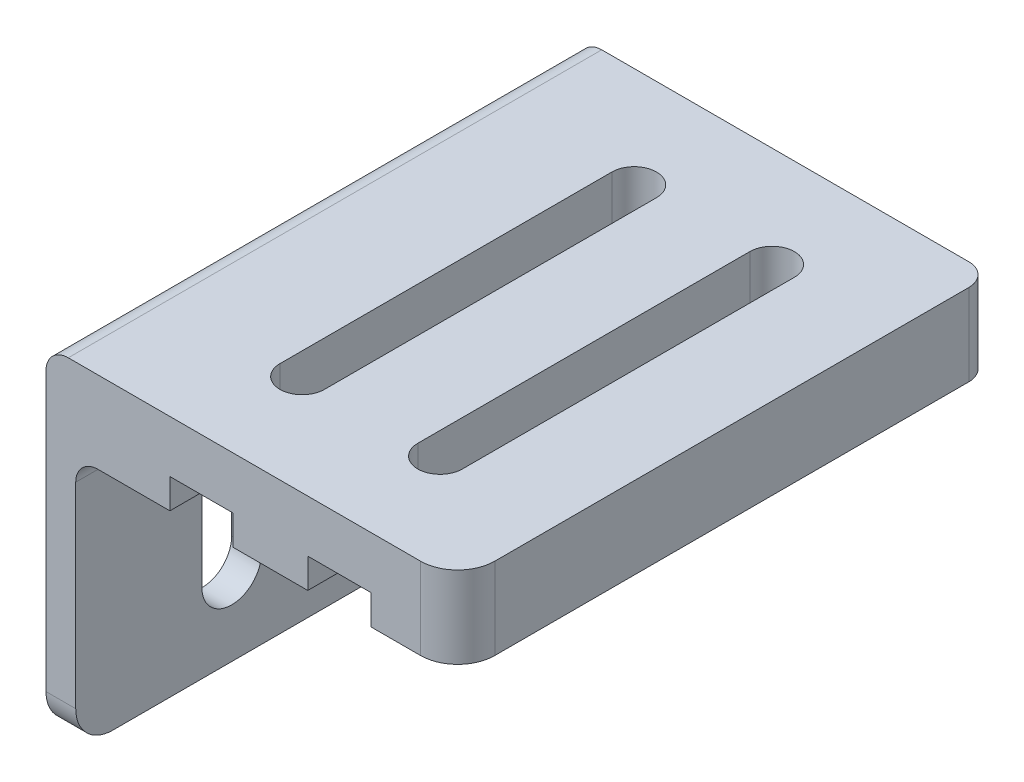
ISO-10303-21;
HEADER;
FILE_DESCRIPTION(('STEP AP214'),'2;1');
FILE_NAME('part.step','',(''),(''),'','','');
FILE_SCHEMA(('AUTOMOTIVE_DESIGN { 1 0 10303 214 1 1 1 1 }'));
ENDSEC;
DATA;
#1=APPLICATION_CONTEXT('core data for automotive mechanical design processes');
#2=APPLICATION_PROTOCOL_DEFINITION('international standard','automotive_design',2000,#1);
#3=PRODUCT_CONTEXT('',#1,'mechanical');
#4=PRODUCT('Part','Part','',(#3));
#5=PRODUCT_RELATED_PRODUCT_CATEGORY('part','',(#4));
#6=PRODUCT_DEFINITION_FORMATION('','',#4);
#7=PRODUCT_DEFINITION_CONTEXT('part definition',#1,'design');
#8=PRODUCT_DEFINITION('design','',#6,#7);
#9=PRODUCT_DEFINITION_SHAPE('','',#8);
#10=(LENGTH_UNIT() NAMED_UNIT(*) SI_UNIT(.MILLI.,.METRE.));
#11=(NAMED_UNIT(*) PLANE_ANGLE_UNIT() SI_UNIT($,.RADIAN.));
#12=(NAMED_UNIT(*) SI_UNIT($,.STERADIAN.) SOLID_ANGLE_UNIT());
#13=UNCERTAINTY_MEASURE_WITH_UNIT(LENGTH_MEASURE(1.E-05),#10,'distance_accuracy_value','');
#14=(GEOMETRIC_REPRESENTATION_CONTEXT(3) GLOBAL_UNCERTAINTY_ASSIGNED_CONTEXT((#13)) GLOBAL_UNIT_ASSIGNED_CONTEXT((#10,
#11,#12)) REPRESENTATION_CONTEXT('',''));
#15=CARTESIAN_POINT('',(0.,0.,0.));
#16=DIRECTION('',(0.,0.,1.));
#17=DIRECTION('',(1.,0.,0.));
#18=AXIS2_PLACEMENT_3D('',#15,#16,#17);
#19=CARTESIAN_POINT('',(153.6,-155.500000000001,112.122877913189));
#20=DIRECTION('',(0.,-1.,0.));
#21=DIRECTION('',(0.,0.,1.));
#22=AXIS2_PLACEMENT_3D('',#19,#20,#21);
#23=PLANE('',#22);
#24=DIRECTION('',(1.,0.,0.));
#25=VECTOR('',#24,1.);
#26=CARTESIAN_POINT('',(144.6,-155.500000000001,56.0614389565943));
#27=LINE('',#26,#25);
#28=CARTESIAN_POINT('',(96.2,-155.500000000001,56.0614389565944));
#29=VERTEX_POINT('',#28);
#30=CARTESIAN_POINT('',(105.872209529196,-155.500000000001,56.0614389565943));
#31=VERTEX_POINT('',#30);
#32=EDGE_CURVE('E413',#29,#31,#27,.T.);
#33=ORIENTED_EDGE('',*,*,#32,.T.);
#34=DIRECTION('',(0.,0.,1.));
#35=VECTOR('',#34,1.);
#36=CARTESIAN_POINT('',(105.872209529196,-155.500000000001,56.0614389565943));
#37=LINE('',#36,#35);
#38=CARTESIAN_POINT('',(105.872209529196,-155.500000000001,127.848398507728));
#39=VERTEX_POINT('',#38);
#40=EDGE_CURVE('E365',#31,#39,#37,.T.);
#41=ORIENTED_EDGE('',*,*,#40,.T.);
#42=DIRECTION('',(-1.,0.,0.));
#43=VECTOR('',#42,1.);
#44=CARTESIAN_POINT('',(153.6,-155.500000000001,127.848398507728));
#45=LINE('',#44,#43);
#46=CARTESIAN_POINT('',(96.2,-155.500000000001,127.848398507728));
#47=VERTEX_POINT('',#46);
#48=EDGE_CURVE('E426',#39,#47,#45,.T.);
#49=ORIENTED_EDGE('',*,*,#48,.T.);
#50=DIRECTION('',(0.,0.,-1.));
#51=VECTOR('',#50,1.);
#52=CARTESIAN_POINT('',(96.2,-155.500000000001,112.122877913189));
#53=LINE('',#52,#51);
#54=EDGE_CURVE('E442',#29,#47,#53,.F.);
#55=ORIENTED_EDGE('',*,*,#54,.F.);
#56=EDGE_LOOP('',(#33,#41,#49,#55));
#57=FACE_BOUND('',#56,.T.);
#58=ADVANCED_FACE('F34',(#57),#23,.T.);
#59=CARTESIAN_POINT('',(93.2,0.,112.122877913189));
#60=DIRECTION('',(-1.,0.,0.));
#61=DIRECTION('',(0.,0.,-1.));
#62=AXIS2_PLACEMENT_3D('',#59,#60,#61);
#63=PLANE('',#62);
#64=DIRECTION('',(0.,1.,0.));
#65=VECTOR('',#64,1.);
#66=CARTESIAN_POINT('',(93.2,-155.500000000001,56.0614389565944));
#67=LINE('',#66,#65);
#68=CARTESIAN_POINT('',(93.2,-184.900000000001,56.0614389565944));
#69=VERTEX_POINT('',#68);
#70=CARTESIAN_POINT('',(93.2,-158.500000000001,56.0614389565944));
#71=VERTEX_POINT('',#70);
#72=EDGE_CURVE('E288',#69,#71,#67,.T.);
#73=ORIENTED_EDGE('',*,*,#72,.T.);
#74=DIRECTION('',(0.,0.,-1.));
#75=VECTOR('',#74,1.);
#76=CARTESIAN_POINT('',(93.2,-158.500000000001,112.122877913189));
#77=LINE('',#76,#75);
#78=CARTESIAN_POINT('',(93.2,-158.500000000001,127.848398507728));
#79=VERTEX_POINT('',#78);
#80=EDGE_CURVE('E439',#79,#71,#77,.T.);
#81=ORIENTED_EDGE('',*,*,#80,.F.);
#82=DIRECTION('',(0.,1.,0.));
#83=VECTOR('',#82,1.);
#84=CARTESIAN_POINT('',(93.2,0.,127.848398507728));
#85=LINE('',#84,#83);
#86=CARTESIAN_POINT('',(93.2,-184.900000000001,127.848398507728));
#87=VERTEX_POINT('',#86);
#88=EDGE_CURVE('E430',#87,#79,#85,.T.);
#89=ORIENTED_EDGE('',*,*,#88,.F.);
#90=CARTESIAN_POINT('',(93.2,-184.900000000001,122.848398507728));
#91=DIRECTION('',(1.,0.,0.));
#92=DIRECTION('',(0.,0.,-1.));
#93=AXIS2_PLACEMENT_3D('',#90,#91,#92);
#94=CIRCLE('',#93,5.);
#95=CARTESIAN_POINT('',(93.2,-189.900000000001,122.848398507728));
#96=VERTEX_POINT('',#95);
#97=EDGE_CURVE('E507',#96,#87,#94,.F.);
#98=ORIENTED_EDGE('',*,*,#97,.F.);
#99=DIRECTION('',(0.,0.,-1.));
#100=VECTOR('',#99,1.);
#101=CARTESIAN_POINT('',(93.2,-189.900000000001,85.8818314169671));
#102=LINE('',#101,#100);
#103=CARTESIAN_POINT('',(93.2,-189.900000000001,61.0614389565944));
#104=VERTEX_POINT('',#103);
#105=EDGE_CURVE('E291',#96,#104,#102,.T.);
#106=ORIENTED_EDGE('',*,*,#105,.T.);
#107=CARTESIAN_POINT('',(93.2,-184.900000000001,61.0614389565944));
#108=DIRECTION('',(1.,0.,0.));
#109=DIRECTION('',(0.,0.,-1.));
#110=AXIS2_PLACEMENT_3D('',#107,#108,#109);
#111=CIRCLE('',#110,5.);
#112=EDGE_CURVE('E42',#69,#104,#111,.F.);
#113=ORIENTED_EDGE('',*,*,#112,.F.);
#114=EDGE_LOOP('',(#73,#81,#89,#98,#106,#113));
#115=FACE_BOUND('',#114,.T.);
#116=DIRECTION('',(0.,1.,0.));
#117=VECTOR('',#116,1.);
#118=CARTESIAN_POINT('',(93.2,0.,102.865114962347));
#119=LINE('',#118,#117);
#120=CARTESIAN_POINT('',(93.2,-179.290104899113,102.865114962347));
#121=VERTEX_POINT('',#120);
#122=CARTESIAN_POINT('',(93.2,-168.408548591911,102.865114962347));
#123=VERTEX_POINT('',#122);
#124=EDGE_CURVE('E265',#121,#123,#119,.T.);
#125=ORIENTED_EDGE('',*,*,#124,.F.);
#126=CARTESIAN_POINT('',(93.2,-179.290104899113,106.865114962347));
#127=DIRECTION('',(1.,0.,0.));
#128=DIRECTION('',(0.,0.,-1.));
#129=AXIS2_PLACEMENT_3D('',#126,#127,#128);
#130=CIRCLE('',#129,4.);
#131=CARTESIAN_POINT('',(93.2,-179.290104899113,110.865114962347));
#132=VERTEX_POINT('',#131);
#133=EDGE_CURVE('E269',#132,#121,#130,.T.);
#134=ORIENTED_EDGE('',*,*,#133,.F.);
#135=DIRECTION('',(0.,-1.,0.));
#136=VECTOR('',#135,1.);
#137=CARTESIAN_POINT('',(93.2,0.,110.865114962347));
#138=LINE('',#137,#136);
#139=CARTESIAN_POINT('',(93.2,-168.408548591911,110.865114962347));
#140=VERTEX_POINT('',#139);
#141=EDGE_CURVE('E248',#140,#132,#138,.T.);
#142=ORIENTED_EDGE('',*,*,#141,.F.);
#143=CARTESIAN_POINT('',(93.2,-168.408548591911,106.865114962347));
#144=DIRECTION('',(1.,0.,0.));
#145=DIRECTION('',(0.,0.,-1.));
#146=AXIS2_PLACEMENT_3D('',#143,#144,#145);
#147=CIRCLE('',#146,4.);
#148=EDGE_CURVE('E258',#123,#140,#147,.T.);
#149=ORIENTED_EDGE('',*,*,#148,.F.);
#150=EDGE_LOOP('',(#125,#134,#142,#149));
#151=FACE_BOUND('',#150,.T.);
#152=ADVANCED_FACE('F267',(#115,#151),#63,.F.);
#153=DIRECTION('',(0.,0.,1.));
#154=VECTOR('',#153,1.);
#155=CARTESIAN_POINT('',(124.427790470804,-155.500000000001,56.0614389565943));
#156=LINE('',#155,#154);
#157=CARTESIAN_POINT('',(124.427790470804,-155.500000000001,56.0614389565943));
#158=VERTEX_POINT('',#157);
#159=CARTESIAN_POINT('',(124.427790470804,-155.500000000001,127.848398507728));
#160=VERTEX_POINT('',#159);
#161=EDGE_CURVE('E371',#158,#160,#156,.T.);
#162=ORIENTED_EDGE('',*,*,#161,.T.);
#163=CARTESIAN_POINT('',(114.372209529196,-155.500000000001,127.848398507728));
#164=VERTEX_POINT('',#163);
#165=EDGE_CURVE('E431',#160,#164,#45,.T.);
#166=ORIENTED_EDGE('',*,*,#165,.T.);
#167=DIRECTION('',(0.,0.,1.));
#168=VECTOR('',#167,1.);
#169=CARTESIAN_POINT('',(114.372209529196,-155.500000000001,56.0614389565943));
#170=LINE('',#169,#168);
#171=CARTESIAN_POINT('',(114.372209529196,-155.500000000001,56.0614389565943));
#172=VERTEX_POINT('',#171);
#173=EDGE_CURVE('E390',#172,#164,#170,.T.);
#174=ORIENTED_EDGE('',*,*,#173,.F.);
#175=EDGE_CURVE('E417',#172,#158,#27,.T.);
#176=ORIENTED_EDGE('',*,*,#175,.T.);
#177=EDGE_LOOP('',(#162,#166,#174,#176));
#178=FACE_BOUND('',#177,.T.);
#179=ADVANCED_FACE('F542',(#178),#23,.T.);
#180=CARTESIAN_POINT('',(89.2,-144.500000000001,112.122877913189));
#181=DIRECTION('',(0.,1.,0.));
#182=DIRECTION('',(0.,0.,-1.));
#183=AXIS2_PLACEMENT_3D('',#180,#181,#182);
#184=PLANE('',#183);
#185=DIRECTION('',(0.,0.,-1.));
#186=VECTOR('',#185,1.);
#187=CARTESIAN_POINT('',(144.6,-144.500000000001,109.910868599365));
#188=LINE('',#187,#186);
#189=CARTESIAN_POINT('',(144.6,-144.500000000001,122.848398507728));
#190=VERTEX_POINT('',#189);
#191=CARTESIAN_POINT('',(144.6,-144.500000000001,59.0614389565943));
#192=VERTEX_POINT('',#191);
#193=EDGE_CURVE('E423',#190,#192,#188,.T.);
#194=ORIENTED_EDGE('',*,*,#193,.T.);
#195=CARTESIAN_POINT('',(141.6,-144.500000000001,59.0614389565943));
#196=DIRECTION('',(0.,-1.,0.));
#197=DIRECTION('',(0.,0.,-1.));
#198=AXIS2_PLACEMENT_3D('',#195,#196,#197);
#199=CIRCLE('',#198,3.);
#200=CARTESIAN_POINT('',(141.6,-144.500000000001,56.0614389565943));
#201=VERTEX_POINT('',#200);
#202=EDGE_CURVE('E457',#201,#192,#199,.T.);
#203=ORIENTED_EDGE('',*,*,#202,.F.);
#204=DIRECTION('',(1.,0.,0.));
#205=VECTOR('',#204,1.);
#206=CARTESIAN_POINT('',(144.6,-144.500000000001,56.0614389565943));
#207=LINE('',#206,#205);
#208=CARTESIAN_POINT('',(92.2,-144.500000000001,56.0614389565944));
#209=VERTEX_POINT('',#208);
#210=EDGE_CURVE('E412',#209,#201,#207,.T.);
#211=ORIENTED_EDGE('',*,*,#210,.F.);
#212=DIRECTION('',(0.,0.,-1.));
#213=VECTOR('',#212,1.);
#214=CARTESIAN_POINT('',(92.2,-144.500000000001,112.122877913189));
#215=LINE('',#214,#213);
#216=CARTESIAN_POINT('',(92.2,-144.500000000001,127.848398507728));
#217=VERTEX_POINT('',#216);
#218=EDGE_CURVE('E454',#217,#209,#215,.T.);
#219=ORIENTED_EDGE('',*,*,#218,.F.);
#220=DIRECTION('',(1.,0.,0.));
#221=VECTOR('',#220,1.);
#222=CARTESIAN_POINT('',(89.2,-144.500000000001,127.848398507728));
#223=LINE('',#222,#221);
#224=CARTESIAN_POINT('',(139.6,-144.500000000001,127.848398507728));
#225=VERTEX_POINT('',#224);
#226=EDGE_CURVE('E435',#217,#225,#223,.T.);
#227=ORIENTED_EDGE('',*,*,#226,.T.);
#228=CARTESIAN_POINT('',(139.6,-144.500000000001,122.848398507728));
#229=DIRECTION('',(0.,-1.,0.));
#230=DIRECTION('',(0.,0.,-1.));
#231=AXIS2_PLACEMENT_3D('',#228,#229,#230);
#232=CIRCLE('',#231,5.);
#233=EDGE_CURVE('E471',#190,#225,#232,.T.);
#234=ORIENTED_EDGE('',*,*,#233,.F.);
#235=EDGE_LOOP('',(#194,#203,#211,#219,#227,#234));
#236=FACE_BOUND('',#235,.T.);
#237=CARTESIAN_POINT('',(110.122209529196,-144.500000000001,114.295393056168));
#238=DIRECTION('',(0.,-1.,0.));
#239=DIRECTION('',(0.,0.,-1.));
#240=AXIS2_PLACEMENT_3D('',#237,#238,#239);
#241=CIRCLE('',#240,3.);
#242=CARTESIAN_POINT('',(113.122209529196,-144.500000000001,114.295393056168));
#243=VERTEX_POINT('',#242);
#244=CARTESIAN_POINT('',(107.122209529196,-144.500000000001,114.295393056168));
#245=VERTEX_POINT('',#244);
#246=EDGE_CURVE('E304',#243,#245,#241,.T.);
#247=ORIENTED_EDGE('',*,*,#246,.T.);
#248=DIRECTION('',(0.,0.,-1.));
#249=VECTOR('',#248,1.);
#250=CARTESIAN_POINT('',(107.122209529196,-144.500000000001,114.295393056168));
#251=LINE('',#250,#249);
#252=CARTESIAN_POINT('',(107.122209529196,-144.500000000001,69.6144444081539));
#253=VERTEX_POINT('',#252);
#254=EDGE_CURVE('E313',#245,#253,#251,.T.);
#255=ORIENTED_EDGE('',*,*,#254,.T.);
#256=CARTESIAN_POINT('',(110.122209529196,-144.500000000001,69.6144444081539));
#257=DIRECTION('',(0.,-1.,0.));
#258=DIRECTION('',(0.,0.,-1.));
#259=AXIS2_PLACEMENT_3D('',#256,#257,#258);
#260=CIRCLE('',#259,3.);
#261=CARTESIAN_POINT('',(113.122209529196,-144.500000000001,69.6144444081539));
#262=VERTEX_POINT('',#261);
#263=EDGE_CURVE('E310',#253,#262,#260,.T.);
#264=ORIENTED_EDGE('',*,*,#263,.T.);
#265=DIRECTION('',(0.,0.,1.));
#266=VECTOR('',#265,1.);
#267=CARTESIAN_POINT('',(113.122209529196,-144.500000000001,114.295393056168));
#268=LINE('',#267,#266);
#269=EDGE_CURVE('E301',#262,#243,#268,.T.);
#270=ORIENTED_EDGE('',*,*,#269,.T.);
#271=EDGE_LOOP('',(#247,#255,#264,#270));
#272=FACE_BOUND('',#271,.T.);
#273=CARTESIAN_POINT('',(128.677790470804,-144.500000000001,114.295393056168));
#274=DIRECTION('',(0.,-1.,0.));
#275=DIRECTION('',(0.,0.,1.));
#276=AXIS2_PLACEMENT_3D('',#273,#274,#275);
#277=CIRCLE('',#276,3.);
#278=CARTESIAN_POINT('',(131.677790470804,-144.500000000001,114.295393056168));
#279=VERTEX_POINT('',#278);
#280=CARTESIAN_POINT('',(125.677790470804,-144.500000000001,114.295393056168));
#281=VERTEX_POINT('',#280);
#282=EDGE_CURVE('E338',#279,#281,#277,.T.);
#283=ORIENTED_EDGE('',*,*,#282,.T.);
#284=DIRECTION('',(0.,0.,-1.));
#285=VECTOR('',#284,1.);
#286=CARTESIAN_POINT('',(125.677790470804,-144.500000000001,114.295393056168));
#287=LINE('',#286,#285);
#288=CARTESIAN_POINT('',(125.677790470804,-144.500000000001,69.6144444081539));
#289=VERTEX_POINT('',#288);
#290=EDGE_CURVE('E347',#281,#289,#287,.T.);
#291=ORIENTED_EDGE('',*,*,#290,.T.);
#292=CARTESIAN_POINT('',(128.677790470804,-144.500000000001,69.6144444081539));
#293=DIRECTION('',(0.,-1.,0.));
#294=DIRECTION('',(0.,0.,1.));
#295=AXIS2_PLACEMENT_3D('',#292,#293,#294);
#296=CIRCLE('',#295,3.);
#297=CARTESIAN_POINT('',(131.677790470804,-144.500000000001,69.6144444081539));
#298=VERTEX_POINT('',#297);
#299=EDGE_CURVE('E344',#289,#298,#296,.T.);
#300=ORIENTED_EDGE('',*,*,#299,.T.);
#301=DIRECTION('',(0.,0.,1.));
#302=VECTOR('',#301,1.);
#303=CARTESIAN_POINT('',(131.677790470804,-144.500000000001,114.295393056168));
#304=LINE('',#303,#302);
#305=EDGE_CURVE('E335',#298,#279,#304,.T.);
#306=ORIENTED_EDGE('',*,*,#305,.T.);
#307=EDGE_LOOP('',(#283,#291,#300,#306));
#308=FACE_BOUND('',#307,.T.);
#309=ADVANCED_FACE('F534',(#236,#272,#308),#184,.T.);
#310=CARTESIAN_POINT('',(89.2,0.,127.848398507728));
#311=DIRECTION('',(0.,0.,1.));
#312=DIRECTION('',(-1.,0.,0.));
#313=AXIS2_PLACEMENT_3D('',#310,#311,#312);
#314=PLANE('',#313);
#315=ORIENTED_EDGE('',*,*,#88,.T.);
#316=CARTESIAN_POINT('',(96.2,-158.500000000001,127.848398507728));
#317=DIRECTION('',(0.,0.,-1.));
#318=DIRECTION('',(-1.,0.,0.));
#319=AXIS2_PLACEMENT_3D('',#316,#317,#318);
#320=CIRCLE('',#319,3.);
#321=EDGE_CURVE('E445',#47,#79,#320,.F.);
#322=ORIENTED_EDGE('',*,*,#321,.F.);
#323=ORIENTED_EDGE('',*,*,#48,.F.);
#324=DIRECTION('',(0.,1.,0.));
#325=VECTOR('',#324,1.);
#326=CARTESIAN_POINT('',(105.872209529196,0.,127.848398507728));
#327=LINE('',#326,#325);
#328=CARTESIAN_POINT('',(105.872209529196,-151.500000000001,127.848398507728));
#329=VERTEX_POINT('',#328);
#330=EDGE_CURVE('E400',#39,#329,#327,.T.);
#331=ORIENTED_EDGE('',*,*,#330,.T.);
#332=DIRECTION('',(1.,0.,0.));
#333=VECTOR('',#332,1.);
#334=CARTESIAN_POINT('',(89.2,-151.500000000001,127.848398507728));
#335=LINE('',#334,#333);
#336=CARTESIAN_POINT('',(114.372209529196,-151.500000000001,127.848398507728));
#337=VERTEX_POINT('',#336);
#338=EDGE_CURVE('E374',#329,#337,#335,.T.);
#339=ORIENTED_EDGE('',*,*,#338,.T.);
#340=DIRECTION('',(0.,-1.,0.));
#341=VECTOR('',#340,1.);
#342=CARTESIAN_POINT('',(114.372209529196,0.,127.848398507728));
#343=LINE('',#342,#341);
#344=EDGE_CURVE('E398',#337,#164,#343,.T.);
#345=ORIENTED_EDGE('',*,*,#344,.T.);
#346=ORIENTED_EDGE('',*,*,#165,.F.);
#347=DIRECTION('',(0.,1.,0.));
#348=VECTOR('',#347,1.);
#349=CARTESIAN_POINT('',(124.427790470804,0.,127.848398507728));
#350=LINE('',#349,#348);
#351=CARTESIAN_POINT('',(124.427790470804,-151.500000000001,127.848398507728));
#352=VERTEX_POINT('',#351);
#353=EDGE_CURVE('E409',#160,#352,#350,.T.);
#354=ORIENTED_EDGE('',*,*,#353,.T.);
#355=DIRECTION('',(1.,0.,0.));
#356=VECTOR('',#355,1.);
#357=CARTESIAN_POINT('',(89.2,-151.500000000001,127.848398507728));
#358=LINE('',#357,#356);
#359=CARTESIAN_POINT('',(132.927790470804,-151.500000000001,127.848398507728));
#360=VERTEX_POINT('',#359);
#361=EDGE_CURVE('E403',#352,#360,#358,.T.);
#362=ORIENTED_EDGE('',*,*,#361,.T.);
#363=DIRECTION('',(0.,-1.,0.));
#364=VECTOR('',#363,1.);
#365=CARTESIAN_POINT('',(132.927790470804,0.,127.848398507728));
#366=LINE('',#365,#364);
#367=CARTESIAN_POINT('',(132.927790470804,-155.500000000001,127.848398507728));
#368=VERTEX_POINT('',#367);
#369=EDGE_CURVE('E406',#360,#368,#366,.T.);
#370=ORIENTED_EDGE('',*,*,#369,.T.);
#371=CARTESIAN_POINT('',(139.6,-155.500000000001,127.848398507728));
#372=VERTEX_POINT('',#371);
#373=EDGE_CURVE('E427',#372,#368,#45,.T.);
#374=ORIENTED_EDGE('',*,*,#373,.F.);
#375=DIRECTION('',(0.,1.,0.));
#376=VECTOR('',#375,1.);
#377=CARTESIAN_POINT('',(139.6,-155.500000000001,127.848398507728));
#378=LINE('',#377,#376);
#379=EDGE_CURVE('E474',#225,#372,#378,.F.);
#380=ORIENTED_EDGE('',*,*,#379,.F.);
#381=ORIENTED_EDGE('',*,*,#226,.F.);
#382=CARTESIAN_POINT('',(92.2,-147.500000000001,127.848398507728));
#383=DIRECTION('',(0.,0.,-1.));
#384=DIRECTION('',(-1.,0.,0.));
#385=AXIS2_PLACEMENT_3D('',#382,#383,#384);
#386=CIRCLE('',#385,3.);
#387=CARTESIAN_POINT('',(89.2,-147.500000000001,127.848398507728));
#388=VERTEX_POINT('',#387);
#389=EDGE_CURVE('E467',#388,#217,#386,.T.);
#390=ORIENTED_EDGE('',*,*,#389,.F.);
#391=DIRECTION('',(0.,1.,0.));
#392=VECTOR('',#391,1.);
#393=CARTESIAN_POINT('',(89.2,0.,127.848398507728));
#394=LINE('',#393,#392);
#395=CARTESIAN_POINT('',(89.2,-184.900000000001,127.848398507728));
#396=VERTEX_POINT('',#395);
#397=EDGE_CURVE('E432',#396,#388,#394,.T.);
#398=ORIENTED_EDGE('',*,*,#397,.F.);
#399=DIRECTION('',(1.,0.,0.));
#400=VECTOR('',#399,1.);
#401=CARTESIAN_POINT('',(89.2,-184.900000000001,127.848398507728));
#402=LINE('',#401,#400);
#403=EDGE_CURVE('E11',#87,#396,#402,.F.);
#404=ORIENTED_EDGE('',*,*,#403,.F.);
#405=EDGE_LOOP('',(#315,#322,#323,#331,#339,#345,#346,#354,#362,#370,#374,#380,#381,#390,#398,#404));
#406=FACE_BOUND('',#405,.T.);
#407=ADVANCED_FACE('F532',(#406),#314,.T.);
#408=CARTESIAN_POINT('',(89.2,0.,112.122877913189));
#409=DIRECTION('',(-1.,0.,0.));
#410=DIRECTION('',(0.,0.,-1.));
#411=AXIS2_PLACEMENT_3D('',#408,#409,#410);
#412=PLANE('',#411);
#413=DIRECTION('',(0.,0.,-1.));
#414=VECTOR('',#413,1.);
#415=CARTESIAN_POINT('',(89.2,-189.900000000001,85.8818314169671));
#416=LINE('',#415,#414);
#417=CARTESIAN_POINT('',(89.2,-189.900000000001,122.848398507728));
#418=VERTEX_POINT('',#417);
#419=CARTESIAN_POINT('',(89.2,-189.900000000001,61.0614389565944));
#420=VERTEX_POINT('',#419);
#421=EDGE_CURVE('E287',#418,#420,#416,.T.);
#422=ORIENTED_EDGE('',*,*,#421,.F.);
#423=CARTESIAN_POINT('',(89.2,-184.900000000001,122.848398507728));
#424=DIRECTION('',(1.,0.,0.));
#425=DIRECTION('',(0.,0.,-1.));
#426=AXIS2_PLACEMENT_3D('',#423,#424,#425);
#427=CIRCLE('',#426,5.);
#428=EDGE_CURVE('E501',#396,#418,#427,.T.);
#429=ORIENTED_EDGE('',*,*,#428,.F.);
#430=ORIENTED_EDGE('',*,*,#397,.T.);
#431=DIRECTION('',(0.,0.,-1.));
#432=VECTOR('',#431,1.);
#433=CARTESIAN_POINT('',(89.2,-147.500000000001,112.122877913189));
#434=LINE('',#433,#432);
#435=CARTESIAN_POINT('',(89.2,-147.500000000001,56.0614389565944));
#436=VERTEX_POINT('',#435);
#437=EDGE_CURVE('E465',#436,#388,#434,.F.);
#438=ORIENTED_EDGE('',*,*,#437,.F.);
#439=DIRECTION('',(0.,1.,0.));
#440=VECTOR('',#439,1.);
#441=CARTESIAN_POINT('',(89.2,-155.500000000001,56.0614389565944));
#442=LINE('',#441,#440);
#443=CARTESIAN_POINT('',(89.2,-184.900000000001,56.0614389565944));
#444=VERTEX_POINT('',#443);
#445=EDGE_CURVE('E416',#444,#436,#442,.T.);
#446=ORIENTED_EDGE('',*,*,#445,.F.);
#447=CARTESIAN_POINT('',(89.2,-184.900000000001,61.0614389565944));
#448=DIRECTION('',(1.,0.,0.));
#449=DIRECTION('',(0.,0.,-1.));
#450=AXIS2_PLACEMENT_3D('',#447,#448,#449);
#451=CIRCLE('',#450,5.);
#452=EDGE_CURVE('E504',#420,#444,#451,.T.);
#453=ORIENTED_EDGE('',*,*,#452,.F.);
#454=EDGE_LOOP('',(#422,#429,#430,#438,#446,#453));
#455=FACE_BOUND('',#454,.T.);
#456=CARTESIAN_POINT('',(89.2,-168.408548591911,106.865114962347));
#457=DIRECTION('',(1.,0.,0.));
#458=DIRECTION('',(0.,0.,-1.));
#459=AXIS2_PLACEMENT_3D('',#456,#457,#458);
#460=CIRCLE('',#459,4.);
#461=CARTESIAN_POINT('',(89.199994,-168.408548591911,102.865114962347));
#462=VERTEX_POINT('',#461);
#463=CARTESIAN_POINT('',(89.199994,-168.408548591911,110.865114962347));
#464=VERTEX_POINT('',#463);
#465=EDGE_CURVE('E494',#462,#464,#460,.T.);
#466=ORIENTED_EDGE('',*,*,#465,.T.);
#467=DIRECTION('',(0.,-1.,0.));
#468=VECTOR('',#467,1.);
#469=CARTESIAN_POINT('',(89.2,0.,110.865114962347));
#470=LINE('',#469,#468);
#471=CARTESIAN_POINT('',(89.199994,-179.290104899113,110.865114962347));
#472=VERTEX_POINT('',#471);
#473=EDGE_CURVE('E251',#464,#472,#470,.T.);
#474=ORIENTED_EDGE('',*,*,#473,.T.);
#475=CARTESIAN_POINT('',(89.2,-179.290104899113,106.865114962347));
#476=DIRECTION('',(1.,0.,0.));
#477=DIRECTION('',(0.,0.,-1.));
#478=AXIS2_PLACEMENT_3D('',#475,#476,#477);
#479=CIRCLE('',#478,4.);
#480=CARTESIAN_POINT('',(89.199994,-179.290104899113,102.865114962347));
#481=VERTEX_POINT('',#480);
#482=EDGE_CURVE('E487',#472,#481,#479,.T.);
#483=ORIENTED_EDGE('',*,*,#482,.T.);
#484=DIRECTION('',(0.,1.,0.));
#485=VECTOR('',#484,1.);
#486=CARTESIAN_POINT('',(89.2,0.,102.865114962347));
#487=LINE('',#486,#485);
#488=EDGE_CURVE('E491',#481,#462,#487,.T.);
#489=ORIENTED_EDGE('',*,*,#488,.T.);
#490=EDGE_LOOP('',(#466,#474,#483,#489));
#491=FACE_BOUND('',#490,.T.);
#492=ADVANCED_FACE('F519',(#455,#491),#412,.T.);
#493=ORIENTED_EDGE('',*,*,#373,.T.);
#494=DIRECTION('',(0.,0.,1.));
#495=VECTOR('',#494,1.);
#496=CARTESIAN_POINT('',(132.927790470804,-155.500000000001,56.0614389565943));
#497=LINE('',#496,#495);
#498=CARTESIAN_POINT('',(132.927790470804,-155.500000000001,56.0614389565943));
#499=VERTEX_POINT('',#498);
#500=EDGE_CURVE('E375',#499,#368,#497,.T.);
#501=ORIENTED_EDGE('',*,*,#500,.F.);
#502=CARTESIAN_POINT('',(141.6,-155.500000000001,56.0614389565943));
#503=VERTEX_POINT('',#502);
#504=EDGE_CURVE('E418',#499,#503,#27,.T.);
#505=ORIENTED_EDGE('',*,*,#504,.T.);
#506=CARTESIAN_POINT('',(141.6,-155.500000000001,59.0614389565943));
#507=DIRECTION('',(0.,1.,0.));
#508=DIRECTION('',(0.,0.,1.));
#509=AXIS2_PLACEMENT_3D('',#506,#507,#508);
#510=CIRCLE('',#509,3.);
#511=CARTESIAN_POINT('',(144.6,-155.500000000001,59.0614389565943));
#512=VERTEX_POINT('',#511);
#513=EDGE_CURVE('E462',#512,#503,#510,.T.);
#514=ORIENTED_EDGE('',*,*,#513,.F.);
#515=DIRECTION('',(0.,0.,1.));
#516=VECTOR('',#515,1.);
#517=CARTESIAN_POINT('',(144.6,-155.500000000001,112.122877913189));
#518=LINE('',#517,#516);
#519=CARTESIAN_POINT('',(144.6,-155.500000000001,122.848398507728));
#520=VERTEX_POINT('',#519);
#521=EDGE_CURVE('E447',#512,#520,#518,.T.);
#522=ORIENTED_EDGE('',*,*,#521,.T.);
#523=CARTESIAN_POINT('',(139.6,-155.500000000001,122.848398507728));
#524=DIRECTION('',(0.,1.,0.));
#525=DIRECTION('',(0.,0.,1.));
#526=AXIS2_PLACEMENT_3D('',#523,#524,#525);
#527=CIRCLE('',#526,5.);
#528=EDGE_CURVE('E477',#372,#520,#527,.T.);
#529=ORIENTED_EDGE('',*,*,#528,.F.);
#530=EDGE_LOOP('',(#493,#501,#505,#514,#522,#529));
#531=FACE_BOUND('',#530,.T.);
#532=ADVANCED_FACE('F540',(#531),#23,.T.);
#533=CARTESIAN_POINT('',(96.2,-158.500000000001,112.122877913189));
#534=DIRECTION('',(0.,0.,-1.));
#535=DIRECTION('',(1.,0.,0.));
#536=AXIS2_PLACEMENT_3D('',#533,#534,#535);
#537=CYLINDRICAL_SURFACE('',#536,3.);
#538=ORIENTED_EDGE('',*,*,#321,.T.);
#539=ORIENTED_EDGE('',*,*,#80,.T.);
#540=CARTESIAN_POINT('',(96.2,-158.500000000001,56.0614389565944));
#541=DIRECTION('',(0.,0.,1.));
#542=DIRECTION('',(1.,0.,0.));
#543=AXIS2_PLACEMENT_3D('',#540,#541,#542);
#544=CIRCLE('',#543,3.);
#545=EDGE_CURVE('E264',#71,#29,#544,.F.);
#546=ORIENTED_EDGE('',*,*,#545,.T.);
#547=ORIENTED_EDGE('',*,*,#54,.T.);
#548=EDGE_LOOP('',(#538,#539,#546,#547));
#549=FACE_BOUND('',#548,.T.);
#550=ADVANCED_FACE('F528',(#549),#537,.F.);
#551=CARTESIAN_POINT('',(144.6,-144.500000000001,109.910868599365));
#552=DIRECTION('',(-1.,0.,0.));
#553=DIRECTION('',(0.,0.,-1.));
#554=AXIS2_PLACEMENT_3D('',#551,#552,#553);
#555=PLANE('',#554);
#556=ORIENTED_EDGE('',*,*,#521,.F.);
#557=DIRECTION('',(0.,1.,0.));
#558=VECTOR('',#557,1.);
#559=CARTESIAN_POINT('',(144.6,-155.500000000001,59.0614389565943));
#560=LINE('',#559,#558);
#561=EDGE_CURVE('E460',#192,#512,#560,.F.);
#562=ORIENTED_EDGE('',*,*,#561,.F.);
#563=ORIENTED_EDGE('',*,*,#193,.F.);
#564=DIRECTION('',(0.,1.,0.));
#565=VECTOR('',#564,1.);
#566=CARTESIAN_POINT('',(144.6,-144.500000000001,122.848398507728));
#567=LINE('',#566,#565);
#568=EDGE_CURVE('E469',#520,#190,#567,.T.);
#569=ORIENTED_EDGE('',*,*,#568,.F.);
#570=EDGE_LOOP('',(#556,#562,#563,#569));
#571=FACE_BOUND('',#570,.T.);
#572=ADVANCED_FACE('F560',(#571),#555,.F.);
#573=CARTESIAN_POINT('',(144.6,-155.500000000001,56.0614389565943));
#574=DIRECTION('',(0.,0.,-1.));
#575=DIRECTION('',(1.,0.,0.));
#576=AXIS2_PLACEMENT_3D('',#573,#574,#575);
#577=PLANE('',#576);
#578=ORIENTED_EDGE('',*,*,#445,.T.);
#579=CARTESIAN_POINT('',(92.2,-147.500000000001,56.0614389565944));
#580=DIRECTION('',(0.,0.,1.));
#581=DIRECTION('',(1.,0.,0.));
#582=AXIS2_PLACEMENT_3D('',#579,#580,#581);
#583=CIRCLE('',#582,3.);
#584=EDGE_CURVE('E450',#209,#436,#583,.T.);
#585=ORIENTED_EDGE('',*,*,#584,.F.);
#586=ORIENTED_EDGE('',*,*,#210,.T.);
#587=DIRECTION('',(0.,1.,0.));
#588=VECTOR('',#587,1.);
#589=CARTESIAN_POINT('',(141.6,-144.500000000001,56.0614389565943));
#590=LINE('',#589,#588);
#591=EDGE_CURVE('E452',#503,#201,#590,.T.);
#592=ORIENTED_EDGE('',*,*,#591,.F.);
#593=ORIENTED_EDGE('',*,*,#504,.F.);
#594=DIRECTION('',(0.,-1.,0.));
#595=VECTOR('',#594,1.);
#596=CARTESIAN_POINT('',(132.927790470804,-155.500000000001,56.0614389565943));
#597=LINE('',#596,#595);
#598=CARTESIAN_POINT('',(132.927790470804,-151.500000000001,56.0614389565943));
#599=VERTEX_POINT('',#598);
#600=EDGE_CURVE('E368',#599,#499,#597,.T.);
#601=ORIENTED_EDGE('',*,*,#600,.F.);
#602=DIRECTION('',(1.,0.,0.));
#603=VECTOR('',#602,1.);
#604=CARTESIAN_POINT('',(132.927790470804,-151.500000000001,56.0614389565943));
#605=LINE('',#604,#603);
#606=CARTESIAN_POINT('',(124.427790470804,-151.500000000001,56.0614389565943));
#607=VERTEX_POINT('',#606);
#608=EDGE_CURVE('E364',#607,#599,#605,.T.);
#609=ORIENTED_EDGE('',*,*,#608,.F.);
#610=DIRECTION('',(0.,1.,0.));
#611=VECTOR('',#610,1.);
#612=CARTESIAN_POINT('',(124.427790470804,-155.500000000001,56.0614389565943));
#613=LINE('',#612,#611);
#614=EDGE_CURVE('E361',#158,#607,#613,.T.);
#615=ORIENTED_EDGE('',*,*,#614,.F.);
#616=ORIENTED_EDGE('',*,*,#175,.F.);
#617=DIRECTION('',(0.,-1.,0.));
#618=VECTOR('',#617,1.);
#619=CARTESIAN_POINT('',(114.372209529196,-155.500000000001,56.0614389565943));
#620=LINE('',#619,#618);
#621=CARTESIAN_POINT('',(114.372209529196,-151.500000000001,56.0614389565943));
#622=VERTEX_POINT('',#621);
#623=EDGE_CURVE('E385',#622,#172,#620,.T.);
#624=ORIENTED_EDGE('',*,*,#623,.F.);
#625=DIRECTION('',(1.,0.,0.));
#626=VECTOR('',#625,1.);
#627=CARTESIAN_POINT('',(105.872209529196,-151.500000000001,56.0614389565943));
#628=LINE('',#627,#626);
#629=CARTESIAN_POINT('',(105.872209529196,-151.500000000001,56.0614389565943));
#630=VERTEX_POINT('',#629);
#631=EDGE_CURVE('E382',#630,#622,#628,.T.);
#632=ORIENTED_EDGE('',*,*,#631,.F.);
#633=DIRECTION('',(0.,1.,0.));
#634=VECTOR('',#633,1.);
#635=CARTESIAN_POINT('',(105.872209529196,-155.500000000001,56.0614389565943));
#636=LINE('',#635,#634);
#637=EDGE_CURVE('E326',#31,#630,#636,.T.);
#638=ORIENTED_EDGE('',*,*,#637,.F.);
#639=ORIENTED_EDGE('',*,*,#32,.F.);
#640=ORIENTED_EDGE('',*,*,#545,.F.);
#641=ORIENTED_EDGE('',*,*,#72,.F.);
#642=DIRECTION('',(-1.,0.,0.));
#643=VECTOR('',#642,1.);
#644=CARTESIAN_POINT('',(144.6,-184.900000000001,56.0614389565943));
#645=LINE('',#644,#643);
#646=EDGE_CURVE('E55',#444,#69,#645,.F.);
#647=ORIENTED_EDGE('',*,*,#646,.F.);
#648=EDGE_LOOP('',(#578,#585,#586,#592,#593,#601,#609,#615,#616,#624,#632,#638,#639,#640,#641,#647));
#649=FACE_BOUND('',#648,.T.);
#650=ADVANCED_FACE('F524',(#649),#577,.T.);
#651=CARTESIAN_POINT('',(141.6,-155.500000000001,59.0614389565943));
#652=DIRECTION('',(0.,-1.,0.));
#653=DIRECTION('',(0.,0.,1.));
#654=AXIS2_PLACEMENT_3D('',#651,#652,#653);
#655=CYLINDRICAL_SURFACE('',#654,3.);
#656=ORIENTED_EDGE('',*,*,#513,.T.);
#657=ORIENTED_EDGE('',*,*,#591,.T.);
#658=ORIENTED_EDGE('',*,*,#202,.T.);
#659=ORIENTED_EDGE('',*,*,#561,.T.);
#660=EDGE_LOOP('',(#656,#657,#658,#659));
#661=FACE_BOUND('',#660,.T.);
#662=ADVANCED_FACE('F606',(#661),#655,.T.);
#663=CARTESIAN_POINT('',(92.2,-147.500000000001,112.122877913189));
#664=DIRECTION('',(0.,0.,-1.));
#665=DIRECTION('',(1.,0.,0.));
#666=AXIS2_PLACEMENT_3D('',#663,#664,#665);
#667=CYLINDRICAL_SURFACE('',#666,3.);
#668=ORIENTED_EDGE('',*,*,#389,.T.);
#669=ORIENTED_EDGE('',*,*,#218,.T.);
#670=ORIENTED_EDGE('',*,*,#584,.T.);
#671=ORIENTED_EDGE('',*,*,#437,.T.);
#672=EDGE_LOOP('',(#668,#669,#670,#671));
#673=FACE_BOUND('',#672,.T.);
#674=ADVANCED_FACE('F600',(#673),#667,.T.);
#675=CARTESIAN_POINT('',(105.872209529196,-155.500000000001,56.0614389565943));
#676=DIRECTION('',(-1.,0.,0.));
#677=DIRECTION('',(0.,0.,-1.));
#678=AXIS2_PLACEMENT_3D('',#675,#676,#677);
#679=PLANE('',#678);
#680=ORIENTED_EDGE('',*,*,#330,.F.);
#681=ORIENTED_EDGE('',*,*,#40,.F.);
#682=ORIENTED_EDGE('',*,*,#637,.T.);
#683=DIRECTION('',(0.,0.,1.));
#684=VECTOR('',#683,1.);
#685=CARTESIAN_POINT('',(105.872209529196,-151.500000000001,56.0614389565943));
#686=LINE('',#685,#684);
#687=EDGE_CURVE('E387',#630,#329,#686,.T.);
#688=ORIENTED_EDGE('',*,*,#687,.T.);
#689=EDGE_LOOP('',(#680,#681,#682,#688));
#690=FACE_BOUND('',#689,.T.);
#691=ADVANCED_FACE('F586',(#690),#679,.F.);
#692=CARTESIAN_POINT('',(114.372209529196,-155.500000000001,56.0614389565943));
#693=DIRECTION('',(1.,0.,0.));
#694=DIRECTION('',(0.,0.,1.));
#695=AXIS2_PLACEMENT_3D('',#692,#693,#694);
#696=PLANE('',#695);
#697=ORIENTED_EDGE('',*,*,#344,.F.);
#698=DIRECTION('',(0.,0.,1.));
#699=VECTOR('',#698,1.);
#700=CARTESIAN_POINT('',(114.372209529196,-151.500000000001,56.0614389565943));
#701=LINE('',#700,#699);
#702=EDGE_CURVE('E393',#622,#337,#701,.T.);
#703=ORIENTED_EDGE('',*,*,#702,.F.);
#704=ORIENTED_EDGE('',*,*,#623,.T.);
#705=ORIENTED_EDGE('',*,*,#173,.T.);
#706=EDGE_LOOP('',(#697,#703,#704,#705));
#707=FACE_BOUND('',#706,.T.);
#708=ADVANCED_FACE('F591',(#707),#696,.F.);
#709=CARTESIAN_POINT('',(105.872209529196,-151.500000000001,56.0614389565943));
#710=DIRECTION('',(0.,1.,0.));
#711=DIRECTION('',(0.,0.,-1.));
#712=AXIS2_PLACEMENT_3D('',#709,#710,#711);
#713=PLANE('',#712);
#714=DIRECTION('',(0.,0.,-1.));
#715=VECTOR('',#714,1.);
#716=CARTESIAN_POINT('',(113.122209529196,-151.500000000001,114.295393056168));
#717=LINE('',#716,#715);
#718=CARTESIAN_POINT('',(113.122209529196,-151.500000000001,114.295393056168));
#719=VERTEX_POINT('',#718);
#720=CARTESIAN_POINT('',(113.122209529196,-151.500000000001,69.6144444081539));
#721=VERTEX_POINT('',#720);
#722=EDGE_CURVE('E320',#719,#721,#717,.T.);
#723=ORIENTED_EDGE('',*,*,#722,.T.);
#724=CARTESIAN_POINT('',(110.122209529196,-151.500000000001,69.6144444081539));
#725=DIRECTION('',(0.,-1.,0.));
#726=DIRECTION('',(0.,0.,-1.));
#727=AXIS2_PLACEMENT_3D('',#724,#725,#726);
#728=CIRCLE('',#727,3.);
#729=CARTESIAN_POINT('',(107.122209529196,-151.500000000001,69.6144444081539));
#730=VERTEX_POINT('',#729);
#731=EDGE_CURVE('E323',#721,#730,#728,.F.);
#732=ORIENTED_EDGE('',*,*,#731,.T.);
#733=DIRECTION('',(0.,0.,1.));
#734=VECTOR('',#733,1.);
#735=CARTESIAN_POINT('',(107.122209529196,-151.500000000001,114.295393056168));
#736=LINE('',#735,#734);
#737=CARTESIAN_POINT('',(107.122209529196,-151.500000000001,114.295393056168));
#738=VERTEX_POINT('',#737);
#739=EDGE_CURVE('E297',#730,#738,#736,.T.);
#740=ORIENTED_EDGE('',*,*,#739,.T.);
#741=CARTESIAN_POINT('',(110.122209529196,-151.500000000001,114.295393056168));
#742=DIRECTION('',(0.,-1.,0.));
#743=DIRECTION('',(0.,0.,-1.));
#744=AXIS2_PLACEMENT_3D('',#741,#742,#743);
#745=CIRCLE('',#744,3.);
#746=EDGE_CURVE('E300',#738,#719,#745,.F.);
#747=ORIENTED_EDGE('',*,*,#746,.T.);
#748=EDGE_LOOP('',(#723,#732,#740,#747));
#749=FACE_BOUND('',#748,.T.);
#750=ORIENTED_EDGE('',*,*,#338,.F.);
#751=ORIENTED_EDGE('',*,*,#687,.F.);
#752=ORIENTED_EDGE('',*,*,#631,.T.);
#753=ORIENTED_EDGE('',*,*,#702,.T.);
#754=EDGE_LOOP('',(#750,#751,#752,#753));
#755=FACE_BOUND('',#754,.T.);
#756=ADVANCED_FACE('F589',(#749,#755),#713,.F.);
#757=CARTESIAN_POINT('',(124.427790470804,-155.500000000001,56.0614389565943));
#758=DIRECTION('',(-1.,0.,0.));
#759=DIRECTION('',(0.,0.,-1.));
#760=AXIS2_PLACEMENT_3D('',#757,#758,#759);
#761=PLANE('',#760);
#762=ORIENTED_EDGE('',*,*,#353,.F.);
#763=ORIENTED_EDGE('',*,*,#161,.F.);
#764=ORIENTED_EDGE('',*,*,#614,.T.);
#765=DIRECTION('',(0.,0.,1.));
#766=VECTOR('',#765,1.);
#767=CARTESIAN_POINT('',(124.427790470804,-151.500000000001,56.0614389565943));
#768=LINE('',#767,#766);
#769=EDGE_CURVE('E370',#607,#352,#768,.T.);
#770=ORIENTED_EDGE('',*,*,#769,.T.);
#771=EDGE_LOOP('',(#762,#763,#764,#770));
#772=FACE_BOUND('',#771,.T.);
#773=ADVANCED_FACE('F580',(#772),#761,.F.);
#774=CARTESIAN_POINT('',(132.927790470804,-155.500000000001,56.0614389565943));
#775=DIRECTION('',(1.,0.,0.));
#776=DIRECTION('',(0.,0.,1.));
#777=AXIS2_PLACEMENT_3D('',#774,#775,#776);
#778=PLANE('',#777);
#779=ORIENTED_EDGE('',*,*,#369,.F.);
#780=DIRECTION('',(0.,0.,1.));
#781=VECTOR('',#780,1.);
#782=CARTESIAN_POINT('',(132.927790470804,-151.500000000001,56.0614389565943));
#783=LINE('',#782,#781);
#784=EDGE_CURVE('E377',#599,#360,#783,.T.);
#785=ORIENTED_EDGE('',*,*,#784,.F.);
#786=ORIENTED_EDGE('',*,*,#600,.T.);
#787=ORIENTED_EDGE('',*,*,#500,.T.);
#788=EDGE_LOOP('',(#779,#785,#786,#787));
#789=FACE_BOUND('',#788,.T.);
#790=ADVANCED_FACE('F568',(#789),#778,.F.);
#791=CARTESIAN_POINT('',(132.927790470804,-151.500000000001,56.0614389565943));
#792=DIRECTION('',(0.,1.,0.));
#793=DIRECTION('',(0.,0.,-1.));
#794=AXIS2_PLACEMENT_3D('',#791,#792,#793);
#795=PLANE('',#794);
#796=DIRECTION('',(0.,0.,-1.));
#797=VECTOR('',#796,1.);
#798=CARTESIAN_POINT('',(131.677790470804,-151.500000000001,114.295393056168));
#799=LINE('',#798,#797);
#800=CARTESIAN_POINT('',(131.677790470804,-151.500000000001,114.295393056168));
#801=VERTEX_POINT('',#800);
#802=CARTESIAN_POINT('',(131.677790470804,-151.500000000001,69.6144444081539));
#803=VERTEX_POINT('',#802);
#804=EDGE_CURVE('E354',#801,#803,#799,.T.);
#805=ORIENTED_EDGE('',*,*,#804,.T.);
#806=CARTESIAN_POINT('',(128.677790470804,-151.500000000001,69.6144444081539));
#807=DIRECTION('',(0.,-1.,0.));
#808=DIRECTION('',(0.,0.,-1.));
#809=AXIS2_PLACEMENT_3D('',#806,#807,#808);
#810=CIRCLE('',#809,3.);
#811=CARTESIAN_POINT('',(125.677790470804,-151.500000000001,69.6144444081539));
#812=VERTEX_POINT('',#811);
#813=EDGE_CURVE('E330',#803,#812,#810,.F.);
#814=ORIENTED_EDGE('',*,*,#813,.T.);
#815=DIRECTION('',(0.,0.,1.));
#816=VECTOR('',#815,1.);
#817=CARTESIAN_POINT('',(125.677790470804,-151.500000000001,114.295393056168));
#818=LINE('',#817,#816);
#819=CARTESIAN_POINT('',(125.677790470804,-151.500000000001,114.295393056168));
#820=VERTEX_POINT('',#819);
#821=EDGE_CURVE('E331',#812,#820,#818,.T.);
#822=ORIENTED_EDGE('',*,*,#821,.T.);
#823=CARTESIAN_POINT('',(128.677790470804,-151.500000000001,114.295393056168));
#824=DIRECTION('',(0.,-1.,0.));
#825=DIRECTION('',(0.,0.,-1.));
#826=AXIS2_PLACEMENT_3D('',#823,#824,#825);
#827=CIRCLE('',#826,3.);
#828=EDGE_CURVE('E334',#820,#801,#827,.F.);
#829=ORIENTED_EDGE('',*,*,#828,.T.);
#830=EDGE_LOOP('',(#805,#814,#822,#829));
#831=FACE_BOUND('',#830,.T.);
#832=ORIENTED_EDGE('',*,*,#361,.F.);
#833=ORIENTED_EDGE('',*,*,#769,.F.);
#834=ORIENTED_EDGE('',*,*,#608,.T.);
#835=ORIENTED_EDGE('',*,*,#784,.T.);
#836=EDGE_LOOP('',(#832,#833,#834,#835));
#837=FACE_BOUND('',#836,.T.);
#838=ADVANCED_FACE('F683',(#831,#837),#795,.F.);
#839=CARTESIAN_POINT('',(128.677790470804,-193.901000000001,114.295393056168));
#840=DIRECTION('',(0.,1.,0.));
#841=DIRECTION('',(0.,0.,-1.));
#842=AXIS2_PLACEMENT_3D('',#839,#840,#841);
#843=CYLINDRICAL_SURFACE('',#842,3.);
#844=ORIENTED_EDGE('',*,*,#828,.F.);
#845=DIRECTION('',(0.,1.,0.));
#846=VECTOR('',#845,1.);
#847=CARTESIAN_POINT('',(125.677790470804,-193.901000000001,114.295393056168));
#848=LINE('',#847,#846);
#849=EDGE_CURVE('E294',#820,#281,#848,.T.);
#850=ORIENTED_EDGE('',*,*,#849,.T.);
#851=ORIENTED_EDGE('',*,*,#282,.F.);
#852=DIRECTION('',(0.,1.,0.));
#853=VECTOR('',#852,1.);
#854=CARTESIAN_POINT('',(131.677790470804,-193.901000000001,114.295393056168));
#855=LINE('',#854,#853);
#856=EDGE_CURVE('E341',#801,#279,#855,.T.);
#857=ORIENTED_EDGE('',*,*,#856,.F.);
#858=EDGE_LOOP('',(#844,#850,#851,#857));
#859=FACE_BOUND('',#858,.T.);
#860=ADVANCED_FACE('F679',(#859),#843,.F.);
#861=CARTESIAN_POINT('',(131.677790470804,-193.901000000001,114.295393056168));
#862=DIRECTION('',(1.,0.,0.));
#863=DIRECTION('',(0.,0.,1.));
#864=AXIS2_PLACEMENT_3D('',#861,#862,#863);
#865=PLANE('',#864);
#866=ORIENTED_EDGE('',*,*,#804,.F.);
#867=ORIENTED_EDGE('',*,*,#856,.T.);
#868=ORIENTED_EDGE('',*,*,#305,.F.);
#869=DIRECTION('',(0.,1.,0.));
#870=VECTOR('',#869,1.);
#871=CARTESIAN_POINT('',(131.677790470804,-193.901000000001,69.6144444081539));
#872=LINE('',#871,#870);
#873=EDGE_CURVE('E339',#803,#298,#872,.T.);
#874=ORIENTED_EDGE('',*,*,#873,.F.);
#875=EDGE_LOOP('',(#866,#867,#868,#874));
#876=FACE_BOUND('',#875,.T.);
#877=ADVANCED_FACE('F672',(#876),#865,.F.);
#878=CARTESIAN_POINT('',(128.677790470804,-193.901000000001,69.6144444081539));
#879=DIRECTION('',(0.,1.,0.));
#880=DIRECTION('',(0.,0.,-1.));
#881=AXIS2_PLACEMENT_3D('',#878,#879,#880);
#882=CYLINDRICAL_SURFACE('',#881,3.);
#883=ORIENTED_EDGE('',*,*,#813,.F.);
#884=ORIENTED_EDGE('',*,*,#873,.T.);
#885=ORIENTED_EDGE('',*,*,#299,.F.);
#886=DIRECTION('',(0.,1.,0.));
#887=VECTOR('',#886,1.);
#888=CARTESIAN_POINT('',(125.677790470804,-193.901000000001,69.6144444081539));
#889=LINE('',#888,#887);
#890=EDGE_CURVE('E336',#812,#289,#889,.T.);
#891=ORIENTED_EDGE('',*,*,#890,.F.);
#892=EDGE_LOOP('',(#883,#884,#885,#891));
#893=FACE_BOUND('',#892,.T.);
#894=ADVANCED_FACE('F669',(#893),#882,.F.);
#895=CARTESIAN_POINT('',(125.677790470804,-193.901000000001,114.295393056168));
#896=DIRECTION('',(-1.,0.,0.));
#897=DIRECTION('',(0.,0.,-1.));
#898=AXIS2_PLACEMENT_3D('',#895,#896,#897);
#899=PLANE('',#898);
#900=ORIENTED_EDGE('',*,*,#821,.F.);
#901=ORIENTED_EDGE('',*,*,#890,.T.);
#902=ORIENTED_EDGE('',*,*,#290,.F.);
#903=ORIENTED_EDGE('',*,*,#849,.F.);
#904=EDGE_LOOP('',(#900,#901,#902,#903));
#905=FACE_BOUND('',#904,.T.);
#906=ADVANCED_FACE('F667',(#905),#899,.F.);
#907=CARTESIAN_POINT('',(110.122209529196,-193.901000000001,114.295393056168));
#908=DIRECTION('',(0.,1.,0.));
#909=DIRECTION('',(0.,0.,-1.));
#910=AXIS2_PLACEMENT_3D('',#907,#908,#909);
#911=CYLINDRICAL_SURFACE('',#910,3.);
#912=ORIENTED_EDGE('',*,*,#746,.F.);
#913=DIRECTION('',(0.,1.,0.));
#914=VECTOR('',#913,1.);
#915=CARTESIAN_POINT('',(107.122209529196,-193.901000000001,114.295393056168));
#916=LINE('',#915,#914);
#917=EDGE_CURVE('E328',#738,#245,#916,.T.);
#918=ORIENTED_EDGE('',*,*,#917,.T.);
#919=ORIENTED_EDGE('',*,*,#246,.F.);
#920=DIRECTION('',(0.,1.,0.));
#921=VECTOR('',#920,1.);
#922=CARTESIAN_POINT('',(113.122209529196,-193.901000000001,114.295393056168));
#923=LINE('',#922,#921);
#924=EDGE_CURVE('E307',#719,#243,#923,.T.);
#925=ORIENTED_EDGE('',*,*,#924,.F.);
#926=EDGE_LOOP('',(#912,#918,#919,#925));
#927=FACE_BOUND('',#926,.T.);
#928=ADVANCED_FACE('F663',(#927),#911,.F.);
#929=CARTESIAN_POINT('',(113.122209529196,-193.901000000001,114.295393056168));
#930=DIRECTION('',(1.,0.,0.));
#931=DIRECTION('',(0.,0.,1.));
#932=AXIS2_PLACEMENT_3D('',#929,#930,#931);
#933=PLANE('',#932);
#934=ORIENTED_EDGE('',*,*,#722,.F.);
#935=ORIENTED_EDGE('',*,*,#924,.T.);
#936=ORIENTED_EDGE('',*,*,#269,.F.);
#937=DIRECTION('',(0.,1.,0.));
#938=VECTOR('',#937,1.);
#939=CARTESIAN_POINT('',(113.122209529196,-193.901000000001,69.6144444081539));
#940=LINE('',#939,#938);
#941=EDGE_CURVE('E305',#721,#262,#940,.T.);
#942=ORIENTED_EDGE('',*,*,#941,.F.);
#943=EDGE_LOOP('',(#934,#935,#936,#942));
#944=FACE_BOUND('',#943,.T.);
#945=ADVANCED_FACE('F656',(#944),#933,.F.);
#946=CARTESIAN_POINT('',(110.122209529196,-193.901000000001,69.6144444081539));
#947=DIRECTION('',(0.,1.,0.));
#948=DIRECTION('',(0.,0.,-1.));
#949=AXIS2_PLACEMENT_3D('',#946,#947,#948);
#950=CYLINDRICAL_SURFACE('',#949,3.);
#951=ORIENTED_EDGE('',*,*,#731,.F.);
#952=ORIENTED_EDGE('',*,*,#941,.T.);
#953=ORIENTED_EDGE('',*,*,#263,.F.);
#954=DIRECTION('',(0.,1.,0.));
#955=VECTOR('',#954,1.);
#956=CARTESIAN_POINT('',(107.122209529196,-193.901000000001,69.6144444081539));
#957=LINE('',#956,#955);
#958=EDGE_CURVE('E302',#730,#253,#957,.T.);
#959=ORIENTED_EDGE('',*,*,#958,.F.);
#960=EDGE_LOOP('',(#951,#952,#953,#959));
#961=FACE_BOUND('',#960,.T.);
#962=ADVANCED_FACE('F653',(#961),#950,.F.);
#963=CARTESIAN_POINT('',(107.122209529196,-193.901000000001,114.295393056168));
#964=DIRECTION('',(-1.,0.,0.));
#965=DIRECTION('',(0.,0.,-1.));
#966=AXIS2_PLACEMENT_3D('',#963,#964,#965);
#967=PLANE('',#966);
#968=ORIENTED_EDGE('',*,*,#739,.F.);
#969=ORIENTED_EDGE('',*,*,#958,.T.);
#970=ORIENTED_EDGE('',*,*,#254,.F.);
#971=ORIENTED_EDGE('',*,*,#917,.F.);
#972=EDGE_LOOP('',(#968,#969,#970,#971));
#973=FACE_BOUND('',#972,.T.);
#974=ADVANCED_FACE('F632',(#973),#967,.F.);
#975=CARTESIAN_POINT('',(139.6,-144.500000000001,122.848398507728));
#976=DIRECTION('',(0.,-1.,0.));
#977=DIRECTION('',(0.,0.,1.));
#978=AXIS2_PLACEMENT_3D('',#975,#976,#977);
#979=CYLINDRICAL_SURFACE('',#978,5.);
#980=ORIENTED_EDGE('',*,*,#528,.T.);
#981=ORIENTED_EDGE('',*,*,#568,.T.);
#982=ORIENTED_EDGE('',*,*,#233,.T.);
#983=ORIENTED_EDGE('',*,*,#379,.T.);
#984=EDGE_LOOP('',(#980,#981,#982,#983));
#985=FACE_BOUND('',#984,.T.);
#986=ADVANCED_FACE('F621',(#985),#979,.T.);
#987=CARTESIAN_POINT('',(93.2,-189.900000000001,85.8818314169671));
#988=DIRECTION('',(0.,-1.,0.));
#989=DIRECTION('',(0.,0.,1.));
#990=AXIS2_PLACEMENT_3D('',#987,#988,#989);
#991=PLANE('',#990);
#992=ORIENTED_EDGE('',*,*,#105,.F.);
#993=DIRECTION('',(1.,0.,0.));
#994=VECTOR('',#993,1.);
#995=CARTESIAN_POINT('',(93.2,-189.900000000001,122.848398507728));
#996=LINE('',#995,#994);
#997=EDGE_CURVE('E497',#418,#96,#996,.T.);
#998=ORIENTED_EDGE('',*,*,#997,.F.);
#999=ORIENTED_EDGE('',*,*,#421,.T.);
#1000=DIRECTION('',(-1.,0.,0.));
#1001=VECTOR('',#1000,1.);
#1002=CARTESIAN_POINT('',(93.2,-189.900000000001,61.0614389565944));
#1003=LINE('',#1002,#1001);
#1004=EDGE_CURVE('E499',#104,#420,#1003,.T.);
#1005=ORIENTED_EDGE('',*,*,#1004,.F.);
#1006=EDGE_LOOP('',(#992,#998,#999,#1005));
#1007=FACE_BOUND('',#1006,.T.);
#1008=ADVANCED_FACE('F516',(#1007),#991,.T.);
#1009=CARTESIAN_POINT('',(144.6,-168.408548591911,106.865114962347));
#1010=DIRECTION('',(-1.,0.,0.));
#1011=DIRECTION('',(0.,0.,-1.));
#1012=AXIS2_PLACEMENT_3D('',#1009,#1010,#1011);
#1013=CYLINDRICAL_SURFACE('',#1012,4.);
#1014=DIRECTION('',(-1.,0.,0.));
#1015=VECTOR('',#1014,1.);
#1016=CARTESIAN_POINT('',(144.6,-168.408548591911,102.865114962347));
#1017=LINE('',#1016,#1015);
#1018=EDGE_CURVE('E260',#123,#462,#1017,.T.);
#1019=ORIENTED_EDGE('',*,*,#1018,.F.);
#1020=ORIENTED_EDGE('',*,*,#148,.T.);
#1021=DIRECTION('',(-1.,0.,0.));
#1022=VECTOR('',#1021,1.);
#1023=CARTESIAN_POINT('',(144.6,-168.408548591911,110.865114962347));
#1024=LINE('',#1023,#1022);
#1025=EDGE_CURVE('E244',#140,#464,#1024,.T.);
#1026=ORIENTED_EDGE('',*,*,#1025,.T.);
#1027=ORIENTED_EDGE('',*,*,#465,.F.);
#1028=EDGE_LOOP('',(#1019,#1020,#1026,#1027));
#1029=FACE_BOUND('',#1028,.T.);
#1030=ADVANCED_FACE('F259',(#1029),#1013,.F.);
#1031=CARTESIAN_POINT('',(144.6,-168.408548591911,102.865114962347));
#1032=DIRECTION('',(0.,0.,-1.));
#1033=DIRECTION('',(0.,-1.,0.));
#1034=AXIS2_PLACEMENT_3D('',#1031,#1032,#1033);
#1035=PLANE('',#1034);
#1036=DIRECTION('',(-1.,0.,0.));
#1037=VECTOR('',#1036,1.);
#1038=CARTESIAN_POINT('',(144.6,-179.290104899113,102.865114962347));
#1039=LINE('',#1038,#1037);
#1040=EDGE_CURVE('E272',#121,#481,#1039,.T.);
#1041=ORIENTED_EDGE('',*,*,#1040,.F.);
#1042=ORIENTED_EDGE('',*,*,#124,.T.);
#1043=ORIENTED_EDGE('',*,*,#1018,.T.);
#1044=ORIENTED_EDGE('',*,*,#488,.F.);
#1045=EDGE_LOOP('',(#1041,#1042,#1043,#1044));
#1046=FACE_BOUND('',#1045,.T.);
#1047=ADVANCED_FACE('F644',(#1046),#1035,.F.);
#1048=CARTESIAN_POINT('',(144.6,-179.290104899113,106.865114962347));
#1049=DIRECTION('',(-1.,0.,0.));
#1050=DIRECTION('',(0.,0.,-1.));
#1051=AXIS2_PLACEMENT_3D('',#1048,#1049,#1050);
#1052=CYLINDRICAL_SURFACE('',#1051,4.);
#1053=DIRECTION('',(-1.,0.,0.));
#1054=VECTOR('',#1053,1.);
#1055=CARTESIAN_POINT('',(144.6,-179.290104899113,110.865114962347));
#1056=LINE('',#1055,#1054);
#1057=EDGE_CURVE('E255',#132,#472,#1056,.T.);
#1058=ORIENTED_EDGE('',*,*,#1057,.F.);
#1059=ORIENTED_EDGE('',*,*,#133,.T.);
#1060=ORIENTED_EDGE('',*,*,#1040,.T.);
#1061=ORIENTED_EDGE('',*,*,#482,.F.);
#1062=EDGE_LOOP('',(#1058,#1059,#1060,#1061));
#1063=FACE_BOUND('',#1062,.T.);
#1064=ADVANCED_FACE('F639',(#1063),#1052,.F.);
#1065=CARTESIAN_POINT('',(144.6,-168.408548591911,110.865114962347));
#1066=DIRECTION('',(0.,0.,1.));
#1067=DIRECTION('',(0.,1.,0.));
#1068=AXIS2_PLACEMENT_3D('',#1065,#1066,#1067);
#1069=PLANE('',#1068);
#1070=ORIENTED_EDGE('',*,*,#1025,.F.);
#1071=ORIENTED_EDGE('',*,*,#141,.T.);
#1072=ORIENTED_EDGE('',*,*,#1057,.T.);
#1073=ORIENTED_EDGE('',*,*,#473,.F.);
#1074=EDGE_LOOP('',(#1070,#1071,#1072,#1073));
#1075=FACE_BOUND('',#1074,.T.);
#1076=ADVANCED_FACE('F246',(#1075),#1069,.F.);
#1077=CARTESIAN_POINT('',(93.2,-184.900000000001,61.0614389565944));
#1078=DIRECTION('',(-1.,0.,0.));
#1079=DIRECTION('',(0.,0.,-1.));
#1080=AXIS2_PLACEMENT_3D('',#1077,#1078,#1079);
#1081=CYLINDRICAL_SURFACE('',#1080,5.);
#1082=ORIENTED_EDGE('',*,*,#112,.T.);
#1083=ORIENTED_EDGE('',*,*,#1004,.T.);
#1084=ORIENTED_EDGE('',*,*,#452,.T.);
#1085=ORIENTED_EDGE('',*,*,#646,.T.);
#1086=EDGE_LOOP('',(#1082,#1083,#1084,#1085));
#1087=FACE_BOUND('',#1086,.T.);
#1088=ADVANCED_FACE('F508',(#1087),#1081,.T.);
#1089=CARTESIAN_POINT('',(93.2,-184.900000000001,122.848398507728));
#1090=DIRECTION('',(1.,0.,0.));
#1091=DIRECTION('',(0.,0.,1.));
#1092=AXIS2_PLACEMENT_3D('',#1089,#1090,#1091);
#1093=CYLINDRICAL_SURFACE('',#1092,5.);
#1094=ORIENTED_EDGE('',*,*,#428,.T.);
#1095=ORIENTED_EDGE('',*,*,#997,.T.);
#1096=ORIENTED_EDGE('',*,*,#97,.T.);
#1097=ORIENTED_EDGE('',*,*,#403,.T.);
#1098=EDGE_LOOP('',(#1094,#1095,#1096,#1097));
#1099=FACE_BOUND('',#1098,.T.);
#1100=ADVANCED_FACE('F36',(#1099),#1093,.T.);
#1101=CLOSED_SHELL('',(#58,#152,#179,#309,#407,#492,#532,#550,#572,#650,#662,#674,#691,#708,
#756,#773,#790,#838,#860,#877,#894,#906,#928,#945,#962,#974,#986,#1008,#1030,#1047,#1064,#1076,
#1088,#1100));
#1102=MANIFOLD_SOLID_BREP('B2',#1101);
#1103=ADVANCED_BREP_SHAPE_REPRESENTATION('',(#18,#1102),#14);
#1104=SHAPE_DEFINITION_REPRESENTATION(#9,#1103);
ENDSEC;
END-ISO-10303-21;
